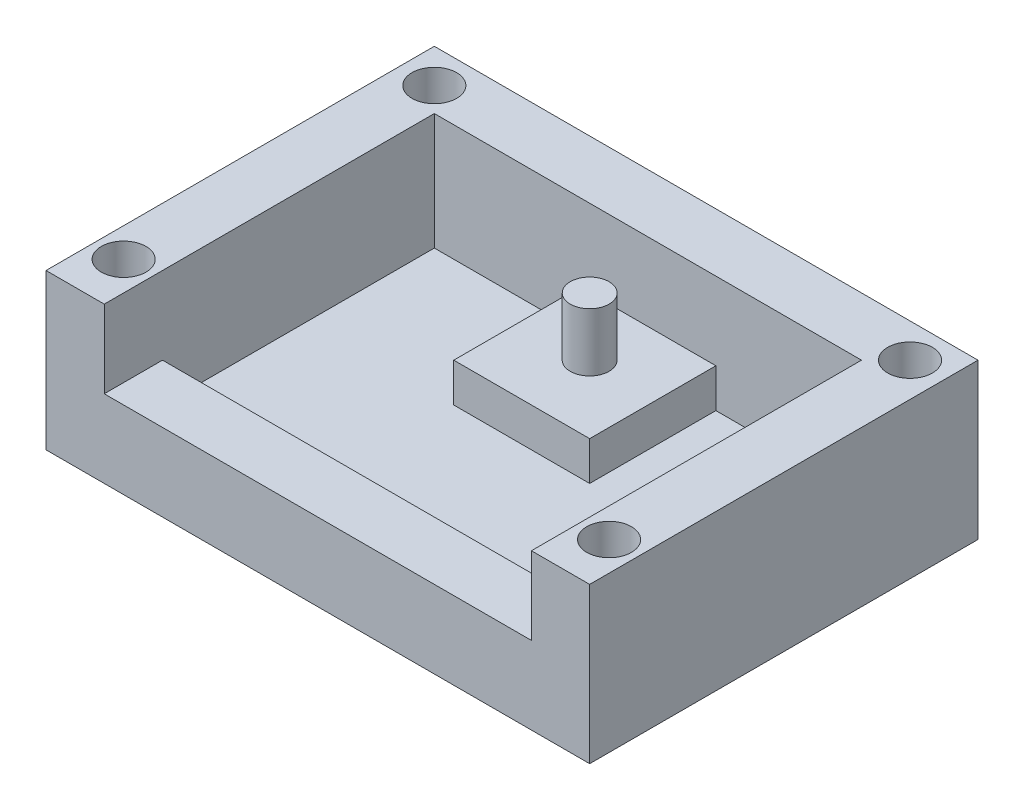
ISO-10303-21;
HEADER;
FILE_DESCRIPTION(('STEP AP214'),'2;1');
FILE_NAME('part.step','',(''),(''),'','','');
FILE_SCHEMA(('AUTOMOTIVE_DESIGN { 1 0 10303 214 1 1 1 1 }'));
ENDSEC;
DATA;
#1=APPLICATION_CONTEXT('core data for automotive mechanical design processes');
#2=APPLICATION_PROTOCOL_DEFINITION('international standard','automotive_design',2000,#1);
#3=PRODUCT_CONTEXT('',#1,'mechanical');
#4=PRODUCT('Part','Part','',(#3));
#5=PRODUCT_RELATED_PRODUCT_CATEGORY('part','',(#4));
#6=PRODUCT_DEFINITION_FORMATION('','',#4);
#7=PRODUCT_DEFINITION_CONTEXT('part definition',#1,'design');
#8=PRODUCT_DEFINITION('design','',#6,#7);
#9=PRODUCT_DEFINITION_SHAPE('','',#8);
#10=(LENGTH_UNIT() NAMED_UNIT(*) SI_UNIT(.MILLI.,.METRE.));
#11=(NAMED_UNIT(*) PLANE_ANGLE_UNIT() SI_UNIT($,.RADIAN.));
#12=(NAMED_UNIT(*) SI_UNIT($,.STERADIAN.) SOLID_ANGLE_UNIT());
#13=UNCERTAINTY_MEASURE_WITH_UNIT(LENGTH_MEASURE(1.E-05),#10,'distance_accuracy_value','');
#14=(GEOMETRIC_REPRESENTATION_CONTEXT(3) GLOBAL_UNCERTAINTY_ASSIGNED_CONTEXT((#13)) GLOBAL_UNIT_ASSIGNED_CONTEXT((#10,
#11,#12)) REPRESENTATION_CONTEXT('',''));
#15=CARTESIAN_POINT('',(0.,0.,0.));
#16=DIRECTION('',(0.,0.,1.));
#17=DIRECTION('',(1.,0.,0.));
#18=AXIS2_PLACEMENT_3D('',#15,#16,#17);
#19=CARTESIAN_POINT('',(-3.,2.,3.));
#20=DIRECTION('',(0.,0.,-1.));
#21=DIRECTION('',(-1.,0.,0.));
#22=AXIS2_PLACEMENT_3D('',#19,#20,#21);
#23=PLANE('',#22);
#24=DIRECTION('',(0.,-1.,0.));
#25=VECTOR('',#24,1.);
#26=CARTESIAN_POINT('',(-17.5,4.,3.));
#27=LINE('',#26,#25);
#28=CARTESIAN_POINT('',(-17.5,4.,3.));
#29=VERTEX_POINT('',#28);
#30=CARTESIAN_POINT('',(-17.5,2.,3.));
#31=VERTEX_POINT('',#30);
#32=EDGE_CURVE('E549',#29,#31,#27,.T.);
#33=ORIENTED_EDGE('',*,*,#32,.F.);
#34=DIRECTION('',(-1.,0.,0.));
#35=VECTOR('',#34,1.);
#36=CARTESIAN_POINT('',(-17.5,4.,3.));
#37=LINE('',#36,#35);
#38=CARTESIAN_POINT('',(-10.5,4.,3.));
#39=VERTEX_POINT('',#38);
#40=EDGE_CURVE('E156',#39,#29,#37,.T.);
#41=ORIENTED_EDGE('',*,*,#40,.F.);
#42=DIRECTION('',(0.,-1.,0.));
#43=VECTOR('',#42,1.);
#44=CARTESIAN_POINT('',(-10.5,4.,3.));
#45=LINE('',#44,#43);
#46=CARTESIAN_POINT('',(-10.5,2.,3.));
#47=VERTEX_POINT('',#46);
#48=EDGE_CURVE('E168',#39,#47,#45,.T.);
#49=ORIENTED_EDGE('',*,*,#48,.T.);
#50=DIRECTION('',(-1.,0.,0.));
#51=VECTOR('',#50,1.);
#52=CARTESIAN_POINT('',(-3.,2.,3.));
#53=LINE('',#52,#51);
#54=CARTESIAN_POINT('',(-3.,2.,3.));
#55=VERTEX_POINT('',#54);
#56=EDGE_CURVE('E224',#55,#47,#53,.T.);
#57=ORIENTED_EDGE('',*,*,#56,.F.);
#58=DIRECTION('',(0.,1.,0.));
#59=VECTOR('',#58,1.);
#60=CARTESIAN_POINT('',(-3.,2.,3.));
#61=LINE('',#60,#59);
#62=CARTESIAN_POINT('',(-3.,8.,3.));
#63=VERTEX_POINT('',#62);
#64=EDGE_CURVE('E243',#55,#63,#61,.T.);
#65=ORIENTED_EDGE('',*,*,#64,.T.);
#66=DIRECTION('',(-1.,0.,0.));
#67=VECTOR('',#66,1.);
#68=CARTESIAN_POINT('',(-3.,8.,3.));
#69=LINE('',#68,#67);
#70=CARTESIAN_POINT('',(-25.,8.,3.));
#71=VERTEX_POINT('',#70);
#72=EDGE_CURVE('E233',#63,#71,#69,.T.);
#73=ORIENTED_EDGE('',*,*,#72,.T.);
#74=DIRECTION('',(0.,1.,0.));
#75=VECTOR('',#74,1.);
#76=CARTESIAN_POINT('',(-25.,2.,3.));
#77=LINE('',#76,#75);
#78=CARTESIAN_POINT('',(-25.,2.,3.));
#79=VERTEX_POINT('',#78);
#80=EDGE_CURVE('E241',#79,#71,#77,.T.);
#81=ORIENTED_EDGE('',*,*,#80,.F.);
#82=EDGE_CURVE('E223',#31,#79,#53,.T.);
#83=ORIENTED_EDGE('',*,*,#82,.F.);
#84=EDGE_LOOP('',(#33,#41,#49,#57,#65,#73,#81,#83));
#85=FACE_BOUND('',#84,.T.);
#86=ADVANCED_FACE('F33',(#85),#23,.F.);
#87=CARTESIAN_POINT('',(0.,2.,0.));
#88=DIRECTION('',(0.,1.,0.));
#89=DIRECTION('',(0.,0.,1.));
#90=AXIS2_PLACEMENT_3D('',#87,#88,#89);
#91=PLANE('',#90);
#92=DIRECTION('',(1.,0.,0.));
#93=VECTOR('',#92,1.);
#94=CARTESIAN_POINT('',(-17.5,2.,9.5));
#95=LINE('',#94,#93);
#96=CARTESIAN_POINT('',(-17.5,2.,9.5));
#97=VERTEX_POINT('',#96);
#98=CARTESIAN_POINT('',(-10.5,2.,9.5));
#99=VERTEX_POINT('',#98);
#100=EDGE_CURVE('E547',#97,#99,#95,.T.);
#101=ORIENTED_EDGE('',*,*,#100,.F.);
#102=DIRECTION('',(0.,0.,1.));
#103=VECTOR('',#102,1.);
#104=CARTESIAN_POINT('',(-17.5,2.,3.));
#105=LINE('',#104,#103);
#106=EDGE_CURVE('E163',#31,#97,#105,.T.);
#107=ORIENTED_EDGE('',*,*,#106,.F.);
#108=ORIENTED_EDGE('',*,*,#82,.T.);
#109=DIRECTION('',(0.,0.,1.));
#110=VECTOR('',#109,1.);
#111=CARTESIAN_POINT('',(-25.,2.,3.));
#112=LINE('',#111,#110);
#113=CARTESIAN_POINT('',(-25.,2.,17.));
#114=VERTEX_POINT('',#113);
#115=EDGE_CURVE('E227',#79,#114,#112,.T.);
#116=ORIENTED_EDGE('',*,*,#115,.T.);
#117=DIRECTION('',(1.,0.,0.));
#118=VECTOR('',#117,1.);
#119=CARTESIAN_POINT('',(-25.,2.,17.));
#120=LINE('',#119,#118);
#121=CARTESIAN_POINT('',(-3.,2.,17.));
#122=VERTEX_POINT('',#121);
#123=EDGE_CURVE('E216',#114,#122,#120,.T.);
#124=ORIENTED_EDGE('',*,*,#123,.T.);
#125=DIRECTION('',(0.,0.,-1.));
#126=VECTOR('',#125,1.);
#127=CARTESIAN_POINT('',(-3.,2.,17.));
#128=LINE('',#127,#126);
#129=EDGE_CURVE('E219',#122,#55,#128,.T.);
#130=ORIENTED_EDGE('',*,*,#129,.T.);
#131=ORIENTED_EDGE('',*,*,#56,.T.);
#132=DIRECTION('',(0.,0.,-1.));
#133=VECTOR('',#132,1.);
#134=CARTESIAN_POINT('',(-10.5,2.,3.));
#135=LINE('',#134,#133);
#136=EDGE_CURVE('E159',#99,#47,#135,.T.);
#137=ORIENTED_EDGE('',*,*,#136,.F.);
#138=EDGE_LOOP('',(#101,#107,#108,#116,#124,#130,#131,#137));
#139=FACE_BOUND('',#138,.T.);
#140=ADVANCED_FACE('F301',(#139),#91,.T.);
#141=CARTESIAN_POINT('',(-25.,2.,17.));
#142=DIRECTION('',(0.,0.,1.));
#143=DIRECTION('',(1.,0.,0.));
#144=AXIS2_PLACEMENT_3D('',#141,#142,#143);
#145=PLANE('',#144);
#146=DIRECTION('',(-1.,0.,0.));
#147=VECTOR('',#146,1.);
#148=CARTESIAN_POINT('',(-25.,4.,17.));
#149=LINE('',#148,#147);
#150=CARTESIAN_POINT('',(-3.,4.,17.));
#151=VERTEX_POINT('',#150);
#152=CARTESIAN_POINT('',(-25.,4.,17.));
#153=VERTEX_POINT('',#152);
#154=EDGE_CURVE('E206',#151,#153,#149,.T.);
#155=ORIENTED_EDGE('',*,*,#154,.F.);
#156=DIRECTION('',(0.,1.,0.));
#157=VECTOR('',#156,1.);
#158=CARTESIAN_POINT('',(-3.,2.,17.));
#159=LINE('',#158,#157);
#160=EDGE_CURVE('E230',#122,#151,#159,.T.);
#161=ORIENTED_EDGE('',*,*,#160,.F.);
#162=ORIENTED_EDGE('',*,*,#123,.F.);
#163=DIRECTION('',(0.,1.,0.));
#164=VECTOR('',#163,1.);
#165=CARTESIAN_POINT('',(-25.,2.,17.));
#166=LINE('',#165,#164);
#167=EDGE_CURVE('E237',#114,#153,#166,.T.);
#168=ORIENTED_EDGE('',*,*,#167,.T.);
#169=EDGE_LOOP('',(#155,#161,#162,#168));
#170=FACE_BOUND('',#169,.T.);
#171=ADVANCED_FACE('F303',(#170),#145,.F.);
#172=CARTESIAN_POINT('',(0.,8.,0.));
#173=DIRECTION('',(-1.,0.,0.));
#174=DIRECTION('',(0.,0.,1.));
#175=AXIS2_PLACEMENT_3D('',#172,#173,#174);
#176=PLANE('',#175);
#177=DIRECTION('',(0.,0.,-1.));
#178=VECTOR('',#177,1.);
#179=CARTESIAN_POINT('',(0.,0.,0.));
#180=LINE('',#179,#178);
#181=CARTESIAN_POINT('',(0.,0.,20.));
#182=VERTEX_POINT('',#181);
#183=CARTESIAN_POINT('',(0.,0.,0.));
#184=VERTEX_POINT('',#183);
#185=EDGE_CURVE('E240',#182,#184,#180,.T.);
#186=ORIENTED_EDGE('',*,*,#185,.T.);
#187=DIRECTION('',(0.,-1.,0.));
#188=VECTOR('',#187,1.);
#189=CARTESIAN_POINT('',(0.,8.,0.));
#190=LINE('',#189,#188);
#191=CARTESIAN_POINT('',(0.,8.,0.));
#192=VERTEX_POINT('',#191);
#193=EDGE_CURVE('E11',#192,#184,#190,.T.);
#194=ORIENTED_EDGE('',*,*,#193,.F.);
#195=DIRECTION('',(0.,0.,-1.));
#196=VECTOR('',#195,1.);
#197=CARTESIAN_POINT('',(0.,8.,0.));
#198=LINE('',#197,#196);
#199=CARTESIAN_POINT('',(0.,8.,20.));
#200=VERTEX_POINT('',#199);
#201=EDGE_CURVE('E247',#200,#192,#198,.T.);
#202=ORIENTED_EDGE('',*,*,#201,.F.);
#203=DIRECTION('',(0.,-1.,0.));
#204=VECTOR('',#203,1.);
#205=CARTESIAN_POINT('',(0.,8.,20.));
#206=LINE('',#205,#204);
#207=EDGE_CURVE('E255',#200,#182,#206,.T.);
#208=ORIENTED_EDGE('',*,*,#207,.T.);
#209=EDGE_LOOP('',(#186,#194,#202,#208));
#210=FACE_BOUND('',#209,.T.);
#211=ADVANCED_FACE('F35',(#210),#176,.F.);
#212=CARTESIAN_POINT('',(0.,8.,0.));
#213=DIRECTION('',(0.,0.,1.));
#214=DIRECTION('',(1.,0.,0.));
#215=AXIS2_PLACEMENT_3D('',#212,#213,#214);
#216=PLANE('',#215);
#217=DIRECTION('',(-1.,0.,0.));
#218=VECTOR('',#217,1.);
#219=CARTESIAN_POINT('',(0.,0.,0.));
#220=LINE('',#219,#218);
#221=CARTESIAN_POINT('',(-28.,0.,0.));
#222=VERTEX_POINT('',#221);
#223=EDGE_CURVE('E258',#184,#222,#220,.T.);
#224=ORIENTED_EDGE('',*,*,#223,.T.);
#225=DIRECTION('',(0.,-1.,0.));
#226=VECTOR('',#225,1.);
#227=CARTESIAN_POINT('',(-28.,8.,0.));
#228=LINE('',#227,#226);
#229=CARTESIAN_POINT('',(-28.,8.,0.));
#230=VERTEX_POINT('',#229);
#231=EDGE_CURVE('E42',#230,#222,#228,.T.);
#232=ORIENTED_EDGE('',*,*,#231,.F.);
#233=DIRECTION('',(-1.,0.,0.));
#234=VECTOR('',#233,1.);
#235=CARTESIAN_POINT('',(0.,8.,0.));
#236=LINE('',#235,#234);
#237=EDGE_CURVE('E87',#192,#230,#236,.T.);
#238=ORIENTED_EDGE('',*,*,#237,.F.);
#239=ORIENTED_EDGE('',*,*,#193,.T.);
#240=EDGE_LOOP('',(#224,#232,#238,#239));
#241=FACE_BOUND('',#240,.T.);
#242=ADVANCED_FACE('F310',(#241),#216,.F.);
#243=CARTESIAN_POINT('',(-28.,8.,0.));
#244=DIRECTION('',(1.,0.,0.));
#245=DIRECTION('',(0.,0.,-1.));
#246=AXIS2_PLACEMENT_3D('',#243,#244,#245);
#247=PLANE('',#246);
#248=DIRECTION('',(0.,0.,1.));
#249=VECTOR('',#248,1.);
#250=CARTESIAN_POINT('',(-28.,0.,0.));
#251=LINE('',#250,#249);
#252=CARTESIAN_POINT('',(-28.,0.,20.));
#253=VERTEX_POINT('',#252);
#254=EDGE_CURVE('E260',#222,#253,#251,.T.);
#255=ORIENTED_EDGE('',*,*,#254,.T.);
#256=DIRECTION('',(0.,-1.,0.));
#257=VECTOR('',#256,1.);
#258=CARTESIAN_POINT('',(-28.,8.,20.));
#259=LINE('',#258,#257);
#260=CARTESIAN_POINT('',(-28.,8.,20.));
#261=VERTEX_POINT('',#260);
#262=EDGE_CURVE('E264',#261,#253,#259,.T.);
#263=ORIENTED_EDGE('',*,*,#262,.F.);
#264=DIRECTION('',(0.,0.,1.));
#265=VECTOR('',#264,1.);
#266=CARTESIAN_POINT('',(-28.,8.,0.));
#267=LINE('',#266,#265);
#268=EDGE_CURVE('E250',#230,#261,#267,.T.);
#269=ORIENTED_EDGE('',*,*,#268,.F.);
#270=ORIENTED_EDGE('',*,*,#231,.T.);
#271=EDGE_LOOP('',(#255,#263,#269,#270));
#272=FACE_BOUND('',#271,.T.);
#273=ADVANCED_FACE('F270',(#272),#247,.F.);
#274=CARTESIAN_POINT('',(0.,8.,20.));
#275=DIRECTION('',(0.,0.,-1.));
#276=DIRECTION('',(-1.,0.,0.));
#277=AXIS2_PLACEMENT_3D('',#274,#275,#276);
#278=PLANE('',#277);
#279=DIRECTION('',(1.,0.,0.));
#280=VECTOR('',#279,1.);
#281=CARTESIAN_POINT('',(-25.,4.,20.));
#282=LINE('',#281,#280);
#283=CARTESIAN_POINT('',(-25.,4.,20.));
#284=VERTEX_POINT('',#283);
#285=CARTESIAN_POINT('',(-3.,4.,20.));
#286=VERTEX_POINT('',#285);
#287=EDGE_CURVE('E201',#284,#286,#282,.T.);
#288=ORIENTED_EDGE('',*,*,#287,.F.);
#289=DIRECTION('',(0.,1.,0.));
#290=VECTOR('',#289,1.);
#291=CARTESIAN_POINT('',(-25.,4.,20.));
#292=LINE('',#291,#290);
#293=CARTESIAN_POINT('',(-25.,8.,20.));
#294=VERTEX_POINT('',#293);
#295=EDGE_CURVE('E209',#284,#294,#292,.T.);
#296=ORIENTED_EDGE('',*,*,#295,.T.);
#297=DIRECTION('',(1.,0.,0.));
#298=VECTOR('',#297,1.);
#299=CARTESIAN_POINT('',(0.,8.,20.));
#300=LINE('',#299,#298);
#301=EDGE_CURVE('E252',#261,#294,#300,.T.);
#302=ORIENTED_EDGE('',*,*,#301,.F.);
#303=ORIENTED_EDGE('',*,*,#262,.T.);
#304=DIRECTION('',(1.,0.,0.));
#305=VECTOR('',#304,1.);
#306=CARTESIAN_POINT('',(0.,0.,20.));
#307=LINE('',#306,#305);
#308=EDGE_CURVE('E80',#253,#182,#307,.T.);
#309=ORIENTED_EDGE('',*,*,#308,.T.);
#310=ORIENTED_EDGE('',*,*,#207,.F.);
#311=CARTESIAN_POINT('',(-3.,8.,20.));
#312=VERTEX_POINT('',#311);
#313=EDGE_CURVE('E58',#312,#200,#300,.T.);
#314=ORIENTED_EDGE('',*,*,#313,.F.);
#315=DIRECTION('',(0.,1.,0.));
#316=VECTOR('',#315,1.);
#317=CARTESIAN_POINT('',(-3.,4.,20.));
#318=LINE('',#317,#316);
#319=EDGE_CURVE('E210',#286,#312,#318,.T.);
#320=ORIENTED_EDGE('',*,*,#319,.F.);
#321=EDGE_LOOP('',(#288,#296,#302,#303,#309,#310,#314,#320));
#322=FACE_BOUND('',#321,.T.);
#323=ADVANCED_FACE('F279',(#322),#278,.F.);
#324=CARTESIAN_POINT('',(0.,8.,0.));
#325=DIRECTION('',(0.,-1.,0.));
#326=DIRECTION('',(0.,0.,-1.));
#327=AXIS2_PLACEMENT_3D('',#324,#325,#326);
#328=PLANE('',#327);
#329=CARTESIAN_POINT('',(-1.5,8.,17.5));
#330=DIRECTION('',(0.,-1.,0.));
#331=DIRECTION('',(0.,0.,1.));
#332=AXIS2_PLACEMENT_3D('',#329,#330,#331);
#333=CIRCLE('',#332,1.15);
#334=CARTESIAN_POINT('',(-1.5,8.,18.65));
#335=VERTEX_POINT('',#334);
#336=EDGE_CURVE('E167',#335,#335,#333,.T.);
#337=ORIENTED_EDGE('',*,*,#336,.T.);
#338=EDGE_LOOP('',(#337));
#339=FACE_BOUND('',#338,.T.);
#340=CARTESIAN_POINT('',(-26.5,8.,17.5));
#341=DIRECTION('',(0.,1.,0.));
#342=DIRECTION('',(0.,0.,1.));
#343=AXIS2_PLACEMENT_3D('',#340,#341,#342);
#344=CIRCLE('',#343,1.15);
#345=CARTESIAN_POINT('',(-26.5,8.,18.65));
#346=VERTEX_POINT('',#345);
#347=EDGE_CURVE('E175',#346,#346,#344,.T.);
#348=ORIENTED_EDGE('',*,*,#347,.F.);
#349=EDGE_LOOP('',(#348));
#350=FACE_BOUND('',#349,.T.);
#351=CARTESIAN_POINT('',(-1.75,8.,1.75));
#352=DIRECTION('',(0.,-1.,0.));
#353=DIRECTION('',(0.,0.,1.));
#354=AXIS2_PLACEMENT_3D('',#351,#352,#353);
#355=CIRCLE('',#354,1.15);
#356=CARTESIAN_POINT('',(-1.75,8.,2.9));
#357=VERTEX_POINT('',#356);
#358=EDGE_CURVE('E181',#357,#357,#355,.T.);
#359=ORIENTED_EDGE('',*,*,#358,.T.);
#360=EDGE_LOOP('',(#359));
#361=FACE_BOUND('',#360,.T.);
#362=CARTESIAN_POINT('',(-26.25,8.,1.75));
#363=DIRECTION('',(0.,1.,0.));
#364=DIRECTION('',(0.,0.,1.));
#365=AXIS2_PLACEMENT_3D('',#362,#363,#364);
#366=CIRCLE('',#365,1.15);
#367=CARTESIAN_POINT('',(-26.25,8.,2.9));
#368=VERTEX_POINT('',#367);
#369=EDGE_CURVE('E187',#368,#368,#366,.T.);
#370=ORIENTED_EDGE('',*,*,#369,.F.);
#371=EDGE_LOOP('',(#370));
#372=FACE_BOUND('',#371,.T.);
#373=ORIENTED_EDGE('',*,*,#301,.T.);
#374=DIRECTION('',(0.,0.,1.));
#375=VECTOR('',#374,1.);
#376=CARTESIAN_POINT('',(-25.,8.,3.));
#377=LINE('',#376,#375);
#378=EDGE_CURVE('E220',#71,#294,#377,.T.);
#379=ORIENTED_EDGE('',*,*,#378,.F.);
#380=ORIENTED_EDGE('',*,*,#72,.F.);
#381=DIRECTION('',(0.,0.,-1.));
#382=VECTOR('',#381,1.);
#383=CARTESIAN_POINT('',(-3.,8.,17.));
#384=LINE('',#383,#382);
#385=EDGE_CURVE('E213',#312,#63,#384,.T.);
#386=ORIENTED_EDGE('',*,*,#385,.F.);
#387=ORIENTED_EDGE('',*,*,#313,.T.);
#388=ORIENTED_EDGE('',*,*,#201,.T.);
#389=ORIENTED_EDGE('',*,*,#237,.T.);
#390=ORIENTED_EDGE('',*,*,#268,.T.);
#391=EDGE_LOOP('',(#373,#379,#380,#386,#387,#388,#389,#390));
#392=FACE_BOUND('',#391,.T.);
#393=ADVANCED_FACE('F294',(#339,#350,#361,#372,#392),#328,.F.);
#394=CARTESIAN_POINT('',(0.,0.,0.));
#395=DIRECTION('',(0.,-1.,0.));
#396=DIRECTION('',(0.,0.,-1.));
#397=AXIS2_PLACEMENT_3D('',#394,#395,#396);
#398=PLANE('',#397);
#399=ORIENTED_EDGE('',*,*,#185,.F.);
#400=ORIENTED_EDGE('',*,*,#308,.F.);
#401=ORIENTED_EDGE('',*,*,#254,.F.);
#402=ORIENTED_EDGE('',*,*,#223,.F.);
#403=EDGE_LOOP('',(#399,#400,#401,#402));
#404=FACE_BOUND('',#403,.T.);
#405=ADVANCED_FACE('F274',(#404),#398,.T.);
#406=CARTESIAN_POINT('',(-25.,2.,3.));
#407=DIRECTION('',(-1.,0.,0.));
#408=DIRECTION('',(0.,0.,1.));
#409=AXIS2_PLACEMENT_3D('',#406,#407,#408);
#410=PLANE('',#409);
#411=ORIENTED_EDGE('',*,*,#378,.T.);
#412=ORIENTED_EDGE('',*,*,#295,.F.);
#413=DIRECTION('',(0.,0.,1.));
#414=VECTOR('',#413,1.);
#415=CARTESIAN_POINT('',(-25.,4.,17.));
#416=LINE('',#415,#414);
#417=EDGE_CURVE('E198',#153,#284,#416,.T.);
#418=ORIENTED_EDGE('',*,*,#417,.F.);
#419=ORIENTED_EDGE('',*,*,#167,.F.);
#420=ORIENTED_EDGE('',*,*,#115,.F.);
#421=ORIENTED_EDGE('',*,*,#80,.T.);
#422=EDGE_LOOP('',(#411,#412,#418,#419,#420,#421));
#423=FACE_BOUND('',#422,.T.);
#424=ADVANCED_FACE('F289',(#423),#410,.F.);
#425=CARTESIAN_POINT('',(-3.,2.,17.));
#426=DIRECTION('',(1.,0.,0.));
#427=DIRECTION('',(0.,0.,-1.));
#428=AXIS2_PLACEMENT_3D('',#425,#426,#427);
#429=PLANE('',#428);
#430=ORIENTED_EDGE('',*,*,#385,.T.);
#431=ORIENTED_EDGE('',*,*,#64,.F.);
#432=ORIENTED_EDGE('',*,*,#129,.F.);
#433=ORIENTED_EDGE('',*,*,#160,.T.);
#434=DIRECTION('',(0.,0.,-1.));
#435=VECTOR('',#434,1.);
#436=CARTESIAN_POINT('',(-3.,4.,17.));
#437=LINE('',#436,#435);
#438=EDGE_CURVE('E204',#286,#151,#437,.T.);
#439=ORIENTED_EDGE('',*,*,#438,.F.);
#440=ORIENTED_EDGE('',*,*,#319,.T.);
#441=EDGE_LOOP('',(#430,#431,#432,#433,#439,#440));
#442=FACE_BOUND('',#441,.T.);
#443=ADVANCED_FACE('F282',(#442),#429,.F.);
#444=CARTESIAN_POINT('',(0.,4.,0.));
#445=DIRECTION('',(0.,1.,0.));
#446=DIRECTION('',(0.,0.,1.));
#447=AXIS2_PLACEMENT_3D('',#444,#445,#446);
#448=PLANE('',#447);
#449=ORIENTED_EDGE('',*,*,#417,.T.);
#450=ORIENTED_EDGE('',*,*,#287,.T.);
#451=ORIENTED_EDGE('',*,*,#438,.T.);
#452=ORIENTED_EDGE('',*,*,#154,.T.);
#453=EDGE_LOOP('',(#449,#450,#451,#452));
#454=FACE_BOUND('',#453,.T.);
#455=ADVANCED_FACE('F287',(#454),#448,.T.);
#456=CARTESIAN_POINT('',(-26.25,6.,1.75));
#457=DIRECTION('',(0.,1.,0.));
#458=DIRECTION('',(0.,0.,1.));
#459=AXIS2_PLACEMENT_3D('',#456,#457,#458);
#460=CYLINDRICAL_SURFACE('',#459,1.15);
#461=CARTESIAN_POINT('',(-26.25,6.,1.75));
#462=DIRECTION('',(0.,1.,0.));
#463=DIRECTION('',(0.,0.,1.));
#464=AXIS2_PLACEMENT_3D('',#461,#462,#463);
#465=CIRCLE('',#464,1.15);
#466=CARTESIAN_POINT('',(-26.25,6.,2.9));
#467=VERTEX_POINT('',#466);
#468=EDGE_CURVE('E190',#467,#467,#465,.T.);
#469=ORIENTED_EDGE('',*,*,#468,.F.);
#470=EDGE_LOOP('',(#469));
#471=FACE_BOUND('',#470,.T.);
#472=ORIENTED_EDGE('',*,*,#369,.T.);
#473=EDGE_LOOP('',(#472));
#474=FACE_BOUND('',#473,.T.);
#475=ADVANCED_FACE('F324',(#471,#474),#460,.F.);
#476=CARTESIAN_POINT('',(-26.25,6.,1.75));
#477=DIRECTION('',(0.,1.,0.));
#478=DIRECTION('',(0.,0.,1.));
#479=AXIS2_PLACEMENT_3D('',#476,#477,#478);
#480=PLANE('',#479);
#481=ORIENTED_EDGE('',*,*,#468,.T.);
#482=EDGE_LOOP('',(#481));
#483=FACE_BOUND('',#482,.T.);
#484=ADVANCED_FACE('F458',(#483),#480,.T.);
#485=CARTESIAN_POINT('',(-1.75,6.,1.75));
#486=DIRECTION('',(0.,1.,0.));
#487=DIRECTION('',(0.,0.,1.));
#488=AXIS2_PLACEMENT_3D('',#485,#486,#487);
#489=CYLINDRICAL_SURFACE('',#488,1.15);
#490=CARTESIAN_POINT('',(-1.75,6.,1.75));
#491=DIRECTION('',(0.,-1.,0.));
#492=DIRECTION('',(0.,0.,1.));
#493=AXIS2_PLACEMENT_3D('',#490,#491,#492);
#494=CIRCLE('',#493,1.15);
#495=CARTESIAN_POINT('',(-1.75,6.,2.9));
#496=VERTEX_POINT('',#495);
#497=EDGE_CURVE('E184',#496,#496,#494,.T.);
#498=ORIENTED_EDGE('',*,*,#497,.T.);
#499=EDGE_LOOP('',(#498));
#500=FACE_BOUND('',#499,.T.);
#501=ORIENTED_EDGE('',*,*,#358,.F.);
#502=EDGE_LOOP('',(#501));
#503=FACE_BOUND('',#502,.T.);
#504=ADVANCED_FACE('F468',(#500,#503),#489,.F.);
#505=CARTESIAN_POINT('',(-1.75,6.,1.75));
#506=DIRECTION('',(0.,1.,0.));
#507=DIRECTION('',(0.,0.,1.));
#508=AXIS2_PLACEMENT_3D('',#505,#506,#507);
#509=PLANE('',#508);
#510=ORIENTED_EDGE('',*,*,#497,.F.);
#511=EDGE_LOOP('',(#510));
#512=FACE_BOUND('',#511,.T.);
#513=ADVANCED_FACE('F478',(#512),#509,.T.);
#514=CARTESIAN_POINT('',(-26.5,6.,17.5));
#515=DIRECTION('',(0.,1.,0.));
#516=DIRECTION('',(0.,0.,1.));
#517=AXIS2_PLACEMENT_3D('',#514,#515,#516);
#518=CYLINDRICAL_SURFACE('',#517,1.15);
#519=CARTESIAN_POINT('',(-26.5,6.,17.5));
#520=DIRECTION('',(0.,1.,0.));
#521=DIRECTION('',(0.,0.,1.));
#522=AXIS2_PLACEMENT_3D('',#519,#520,#521);
#523=CIRCLE('',#522,1.15);
#524=CARTESIAN_POINT('',(-26.5,6.,18.65));
#525=VERTEX_POINT('',#524);
#526=EDGE_CURVE('E178',#525,#525,#523,.T.);
#527=ORIENTED_EDGE('',*,*,#526,.F.);
#528=EDGE_LOOP('',(#527));
#529=FACE_BOUND('',#528,.T.);
#530=ORIENTED_EDGE('',*,*,#347,.T.);
#531=EDGE_LOOP('',(#530));
#532=FACE_BOUND('',#531,.T.);
#533=ADVANCED_FACE('F487',(#529,#532),#518,.F.);
#534=CARTESIAN_POINT('',(-26.5,6.,17.5));
#535=DIRECTION('',(0.,1.,0.));
#536=DIRECTION('',(0.,0.,1.));
#537=AXIS2_PLACEMENT_3D('',#534,#535,#536);
#538=PLANE('',#537);
#539=ORIENTED_EDGE('',*,*,#526,.T.);
#540=EDGE_LOOP('',(#539));
#541=FACE_BOUND('',#540,.T.);
#542=ADVANCED_FACE('F362',(#541),#538,.T.);
#543=CARTESIAN_POINT('',(-1.5,6.,17.5));
#544=DIRECTION('',(0.,1.,0.));
#545=DIRECTION('',(0.,0.,1.));
#546=AXIS2_PLACEMENT_3D('',#543,#544,#545);
#547=CYLINDRICAL_SURFACE('',#546,1.15);
#548=CARTESIAN_POINT('',(-1.5,6.,17.5));
#549=DIRECTION('',(0.,-1.,0.));
#550=DIRECTION('',(0.,0.,1.));
#551=AXIS2_PLACEMENT_3D('',#548,#549,#550);
#552=CIRCLE('',#551,1.15);
#553=CARTESIAN_POINT('',(-1.5,6.,18.65));
#554=VERTEX_POINT('',#553);
#555=EDGE_CURVE('E172',#554,#554,#552,.T.);
#556=ORIENTED_EDGE('',*,*,#555,.T.);
#557=EDGE_LOOP('',(#556));
#558=FACE_BOUND('',#557,.T.);
#559=ORIENTED_EDGE('',*,*,#336,.F.);
#560=EDGE_LOOP('',(#559));
#561=FACE_BOUND('',#560,.T.);
#562=ADVANCED_FACE('F367',(#558,#561),#547,.F.);
#563=CARTESIAN_POINT('',(-1.5,6.,17.5));
#564=DIRECTION('',(0.,1.,0.));
#565=DIRECTION('',(0.,0.,1.));
#566=AXIS2_PLACEMENT_3D('',#563,#564,#565);
#567=PLANE('',#566);
#568=ORIENTED_EDGE('',*,*,#555,.F.);
#569=EDGE_LOOP('',(#568));
#570=FACE_BOUND('',#569,.T.);
#571=ADVANCED_FACE('F372',(#570),#567,.T.);
#572=CARTESIAN_POINT('',(-17.5,4.,3.));
#573=DIRECTION('',(1.,0.,0.));
#574=DIRECTION('',(0.,0.,-1.));
#575=AXIS2_PLACEMENT_3D('',#572,#573,#574);
#576=PLANE('',#575);
#577=ORIENTED_EDGE('',*,*,#106,.T.);
#578=DIRECTION('',(0.,-1.,0.));
#579=VECTOR('',#578,1.);
#580=CARTESIAN_POINT('',(-17.5,4.,9.5));
#581=LINE('',#580,#579);
#582=CARTESIAN_POINT('',(-17.5,4.,9.5));
#583=VERTEX_POINT('',#582);
#584=EDGE_CURVE('E147',#583,#97,#581,.T.);
#585=ORIENTED_EDGE('',*,*,#584,.F.);
#586=DIRECTION('',(0.,0.,1.));
#587=VECTOR('',#586,1.);
#588=CARTESIAN_POINT('',(-17.5,4.,3.));
#589=LINE('',#588,#587);
#590=EDGE_CURVE('E151',#29,#583,#589,.T.);
#591=ORIENTED_EDGE('',*,*,#590,.F.);
#592=ORIENTED_EDGE('',*,*,#32,.T.);
#593=EDGE_LOOP('',(#577,#585,#591,#592));
#594=FACE_BOUND('',#593,.T.);
#595=ADVANCED_FACE('F161',(#594),#576,.F.);
#596=CARTESIAN_POINT('',(-17.5,4.,9.5));
#597=DIRECTION('',(0.,0.,-1.));
#598=DIRECTION('',(-1.,0.,0.));
#599=AXIS2_PLACEMENT_3D('',#596,#597,#598);
#600=PLANE('',#599);
#601=ORIENTED_EDGE('',*,*,#100,.T.);
#602=DIRECTION('',(0.,-1.,0.));
#603=VECTOR('',#602,1.);
#604=CARTESIAN_POINT('',(-10.5,4.,9.5));
#605=LINE('',#604,#603);
#606=CARTESIAN_POINT('',(-10.5,4.,9.5));
#607=VERTEX_POINT('',#606);
#608=EDGE_CURVE('E49',#607,#99,#605,.T.);
#609=ORIENTED_EDGE('',*,*,#608,.F.);
#610=DIRECTION('',(1.,0.,0.));
#611=VECTOR('',#610,1.);
#612=CARTESIAN_POINT('',(-17.5,4.,9.5));
#613=LINE('',#612,#611);
#614=EDGE_CURVE('E143',#583,#607,#613,.T.);
#615=ORIENTED_EDGE('',*,*,#614,.F.);
#616=ORIENTED_EDGE('',*,*,#584,.T.);
#617=EDGE_LOOP('',(#601,#609,#615,#616));
#618=FACE_BOUND('',#617,.T.);
#619=ADVANCED_FACE('F145',(#618),#600,.F.);
#620=CARTESIAN_POINT('',(-10.5,4.,3.));
#621=DIRECTION('',(-1.,0.,0.));
#622=DIRECTION('',(0.,0.,1.));
#623=AXIS2_PLACEMENT_3D('',#620,#621,#622);
#624=PLANE('',#623);
#625=ORIENTED_EDGE('',*,*,#136,.T.);
#626=ORIENTED_EDGE('',*,*,#48,.F.);
#627=DIRECTION('',(0.,0.,-1.));
#628=VECTOR('',#627,1.);
#629=CARTESIAN_POINT('',(-10.5,4.,3.));
#630=LINE('',#629,#628);
#631=EDGE_CURVE('E150',#607,#39,#630,.T.);
#632=ORIENTED_EDGE('',*,*,#631,.F.);
#633=ORIENTED_EDGE('',*,*,#608,.T.);
#634=EDGE_LOOP('',(#625,#626,#632,#633));
#635=FACE_BOUND('',#634,.T.);
#636=ADVANCED_FACE('F409',(#635),#624,.F.);
#637=CARTESIAN_POINT('',(0.,4.,0.));
#638=DIRECTION('',(0.,1.,0.));
#639=DIRECTION('',(0.,0.,1.));
#640=AXIS2_PLACEMENT_3D('',#637,#638,#639);
#641=PLANE('',#640);
#642=CARTESIAN_POINT('',(-14.,4.,6.));
#643=DIRECTION('',(0.,1.,0.));
#644=DIRECTION('',(0.,0.,1.));
#645=AXIS2_PLACEMENT_3D('',#642,#643,#644);
#646=CIRCLE('',#645,1.);
#647=CARTESIAN_POINT('',(-14.,4.,7.));
#648=VERTEX_POINT('',#647);
#649=EDGE_CURVE('E37',#648,#648,#646,.T.);
#650=ORIENTED_EDGE('',*,*,#649,.F.);
#651=EDGE_LOOP('',(#650));
#652=FACE_BOUND('',#651,.T.);
#653=ORIENTED_EDGE('',*,*,#590,.T.);
#654=ORIENTED_EDGE('',*,*,#614,.T.);
#655=ORIENTED_EDGE('',*,*,#631,.T.);
#656=ORIENTED_EDGE('',*,*,#40,.T.);
#657=EDGE_LOOP('',(#653,#654,#655,#656));
#658=FACE_BOUND('',#657,.T.);
#659=ADVANCED_FACE('F154',(#652,#658),#641,.T.);
#660=CARTESIAN_POINT('',(-14.,7.,6.));
#661=DIRECTION('',(0.,1.,0.));
#662=DIRECTION('',(0.,0.,1.));
#663=AXIS2_PLACEMENT_3D('',#660,#661,#662);
#664=PLANE('',#663);
#665=CARTESIAN_POINT('',(-14.,7.,6.));
#666=DIRECTION('',(0.,1.,0.));
#667=DIRECTION('',(0.,0.,1.));
#668=AXIS2_PLACEMENT_3D('',#665,#666,#667);
#669=CIRCLE('',#668,1.);
#670=CARTESIAN_POINT('',(-14.,7.,7.));
#671=VERTEX_POINT('',#670);
#672=EDGE_CURVE('E193',#671,#671,#669,.T.);
#673=ORIENTED_EDGE('',*,*,#672,.T.);
#674=EDGE_LOOP('',(#673));
#675=FACE_BOUND('',#674,.T.);
#676=ADVANCED_FACE('F426',(#675),#664,.T.);
#677=CARTESIAN_POINT('',(-14.,7.,6.));
#678=DIRECTION('',(0.,-1.,0.));
#679=DIRECTION('',(0.,0.,-1.));
#680=AXIS2_PLACEMENT_3D('',#677,#678,#679);
#681=CYLINDRICAL_SURFACE('',#680,1.);
#682=ORIENTED_EDGE('',*,*,#649,.T.);
#683=EDGE_LOOP('',(#682));
#684=FACE_BOUND('',#683,.T.);
#685=ORIENTED_EDGE('',*,*,#672,.F.);
#686=EDGE_LOOP('',(#685));
#687=FACE_BOUND('',#686,.T.);
#688=ADVANCED_FACE('F433',(#684,#687),#681,.T.);
#689=CLOSED_SHELL('',(#86,#140,#171,#211,#242,#273,#323,#393,#405,#424,#443,#455,#475,#484,#504,
#513,#533,#542,#562,#571,#595,#619,#636,#659,#676,#688));
#690=MANIFOLD_SOLID_BREP('B2',#689);
#691=ADVANCED_BREP_SHAPE_REPRESENTATION('',(#18,#690),#14);
#692=SHAPE_DEFINITION_REPRESENTATION(#9,#691);
ENDSEC;
END-ISO-10303-21;
